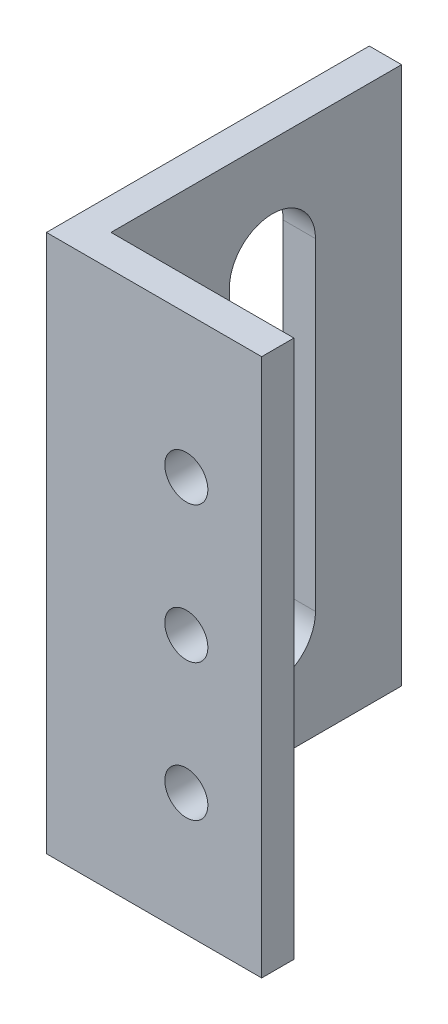
ISO-10303-21;
HEADER;
FILE_DESCRIPTION(('STEP AP214'),'2;1');
FILE_NAME('part.step','',(''),(''),'','','');
FILE_SCHEMA(('AUTOMOTIVE_DESIGN { 1 0 10303 214 1 1 1 1 }'));
ENDSEC;
DATA;
#1=APPLICATION_CONTEXT('core data for automotive mechanical design processes');
#2=APPLICATION_PROTOCOL_DEFINITION('international standard','automotive_design',2000,#1);
#3=PRODUCT_CONTEXT('',#1,'mechanical');
#4=PRODUCT('Part','Part','',(#3));
#5=PRODUCT_RELATED_PRODUCT_CATEGORY('part','',(#4));
#6=PRODUCT_DEFINITION_FORMATION('','',#4);
#7=PRODUCT_DEFINITION_CONTEXT('part definition',#1,'design');
#8=PRODUCT_DEFINITION('design','',#6,#7);
#9=PRODUCT_DEFINITION_SHAPE('','',#8);
#10=(LENGTH_UNIT() NAMED_UNIT(*) SI_UNIT(.MILLI.,.METRE.));
#11=(NAMED_UNIT(*) PLANE_ANGLE_UNIT() SI_UNIT($,.RADIAN.));
#12=(NAMED_UNIT(*) SI_UNIT($,.STERADIAN.) SOLID_ANGLE_UNIT());
#13=UNCERTAINTY_MEASURE_WITH_UNIT(LENGTH_MEASURE(1.E-05),#10,'distance_accuracy_value','');
#14=(GEOMETRIC_REPRESENTATION_CONTEXT(3) GLOBAL_UNCERTAINTY_ASSIGNED_CONTEXT((#13)) GLOBAL_UNIT_ASSIGNED_CONTEXT((#10,
#11,#12)) REPRESENTATION_CONTEXT('',''));
#15=CARTESIAN_POINT('',(0.,0.,0.));
#16=DIRECTION('',(0.,0.,1.));
#17=DIRECTION('',(1.,0.,0.));
#18=AXIS2_PLACEMENT_3D('',#15,#16,#17);
#19=CARTESIAN_POINT('',(-1.5,50.,0.));
#20=DIRECTION('',(1.,0.,0.));
#21=DIRECTION('',(0.,0.,-1.));
#22=AXIS2_PLACEMENT_3D('',#19,#20,#21);
#23=PLANE('',#22);
#24=DIRECTION('',(0.,-1.,0.));
#25=VECTOR('',#24,1.);
#26=CARTESIAN_POINT('',(-1.5,40.,-7.));
#27=LINE('',#26,#25);
#28=CARTESIAN_POINT('',(-1.5,40.,-7.));
#29=VERTEX_POINT('',#28);
#30=CARTESIAN_POINT('',(-1.5,10.,-7.));
#31=VERTEX_POINT('',#30);
#32=EDGE_CURVE('E128',#29,#31,#27,.T.);
#33=ORIENTED_EDGE('',*,*,#32,.F.);
#34=CARTESIAN_POINT('',(-1.5,40.,-3.));
#35=DIRECTION('',(-1.,0.,0.));
#36=DIRECTION('',(0.,0.,1.));
#37=AXIS2_PLACEMENT_3D('',#34,#35,#36);
#38=CIRCLE('',#37,4.);
#39=CARTESIAN_POINT('',(-1.5,40.,1.));
#40=VERTEX_POINT('',#39);
#41=EDGE_CURVE('E55',#40,#29,#38,.T.);
#42=ORIENTED_EDGE('',*,*,#41,.F.);
#43=DIRECTION('',(0.,1.,0.));
#44=VECTOR('',#43,1.);
#45=CARTESIAN_POINT('',(-1.5,40.,1.));
#46=LINE('',#45,#44);
#47=CARTESIAN_POINT('',(-1.5,10.,1.));
#48=VERTEX_POINT('',#47);
#49=EDGE_CURVE('E134',#48,#40,#46,.T.);
#50=ORIENTED_EDGE('',*,*,#49,.F.);
#51=CARTESIAN_POINT('',(-1.5,10.,-3.));
#52=DIRECTION('',(-1.,0.,0.));
#53=DIRECTION('',(0.,0.,1.));
#54=AXIS2_PLACEMENT_3D('',#51,#52,#53);
#55=CIRCLE('',#54,4.);
#56=EDGE_CURVE('E119',#31,#48,#55,.T.);
#57=ORIENTED_EDGE('',*,*,#56,.F.);
#58=EDGE_LOOP('',(#33,#42,#50,#57));
#59=FACE_BOUND('',#58,.T.);
#60=DIRECTION('',(0.,0.,1.));
#61=VECTOR('',#60,1.);
#62=CARTESIAN_POINT('',(-1.5,0.,0.));
#63=LINE('',#62,#61);
#64=CARTESIAN_POINT('',(-1.5,0.,-15.));
#65=VERTEX_POINT('',#64);
#66=CARTESIAN_POINT('',(-1.5,0.,15.));
#67=VERTEX_POINT('',#66);
#68=EDGE_CURVE('E171',#65,#67,#63,.T.);
#69=ORIENTED_EDGE('',*,*,#68,.T.);
#70=DIRECTION('',(0.,-1.,0.));
#71=VECTOR('',#70,1.);
#72=CARTESIAN_POINT('',(-1.5,50.,15.));
#73=LINE('',#72,#71);
#74=CARTESIAN_POINT('',(-1.5,50.,15.));
#75=VERTEX_POINT('',#74);
#76=EDGE_CURVE('E198',#75,#67,#73,.T.);
#77=ORIENTED_EDGE('',*,*,#76,.F.);
#78=DIRECTION('',(0.,0.,1.));
#79=VECTOR('',#78,1.);
#80=CARTESIAN_POINT('',(-1.5,50.,0.));
#81=LINE('',#80,#79);
#82=CARTESIAN_POINT('',(-1.5,50.,-15.));
#83=VERTEX_POINT('',#82);
#84=EDGE_CURVE('E153',#83,#75,#81,.T.);
#85=ORIENTED_EDGE('',*,*,#84,.F.);
#86=DIRECTION('',(0.,-1.,0.));
#87=VECTOR('',#86,1.);
#88=CARTESIAN_POINT('',(-1.5,50.,-15.));
#89=LINE('',#88,#87);
#90=EDGE_CURVE('E170',#83,#65,#89,.T.);
#91=ORIENTED_EDGE('',*,*,#90,.T.);
#92=EDGE_LOOP('',(#69,#77,#85,#91));
#93=FACE_BOUND('',#92,.T.);
#94=ADVANCED_FACE('F41',(#59,#93),#23,.F.);
#95=CARTESIAN_POINT('',(0.,50.,15.));
#96=DIRECTION('',(0.,0.,-1.));
#97=DIRECTION('',(-1.,0.,0.));
#98=AXIS2_PLACEMENT_3D('',#95,#96,#97);
#99=PLANE('',#98);
#100=CARTESIAN_POINT('',(11.5,36.8,15.));
#101=DIRECTION('',(0.,0.,1.));
#102=DIRECTION('',(1.,0.,0.));
#103=AXIS2_PLACEMENT_3D('',#100,#101,#102);
#104=CIRCLE('',#103,2.);
#105=CARTESIAN_POINT('',(13.5,36.8,15.));
#106=VERTEX_POINT('',#105);
#107=EDGE_CURVE('E144',#106,#106,#104,.T.);
#108=ORIENTED_EDGE('',*,*,#107,.F.);
#109=EDGE_LOOP('',(#108));
#110=FACE_BOUND('',#109,.T.);
#111=CARTESIAN_POINT('',(11.5000000000001,24.1,15.));
#112=DIRECTION('',(0.,0.,1.));
#113=DIRECTION('',(1.,0.,0.));
#114=AXIS2_PLACEMENT_3D('',#111,#112,#113);
#115=CIRCLE('',#114,2.);
#116=CARTESIAN_POINT('',(13.5000000000001,24.1,15.));
#117=VERTEX_POINT('',#116);
#118=EDGE_CURVE('E148',#117,#117,#115,.T.);
#119=ORIENTED_EDGE('',*,*,#118,.F.);
#120=EDGE_LOOP('',(#119));
#121=FACE_BOUND('',#120,.T.);
#122=CARTESIAN_POINT('',(11.5000000000003,11.4,15.));
#123=DIRECTION('',(0.,0.,1.));
#124=DIRECTION('',(1.,0.,0.));
#125=AXIS2_PLACEMENT_3D('',#122,#123,#124);
#126=CIRCLE('',#125,2.);
#127=CARTESIAN_POINT('',(13.5000000000003,11.4,15.));
#128=VERTEX_POINT('',#127);
#129=EDGE_CURVE('E141',#128,#128,#126,.T.);
#130=ORIENTED_EDGE('',*,*,#129,.F.);
#131=EDGE_LOOP('',(#130));
#132=FACE_BOUND('',#131,.T.);
#133=DIRECTION('',(1.,0.,0.));
#134=VECTOR('',#133,1.);
#135=CARTESIAN_POINT('',(0.,0.,15.));
#136=LINE('',#135,#134);
#137=CARTESIAN_POINT('',(18.5,0.,15.));
#138=VERTEX_POINT('',#137);
#139=EDGE_CURVE('E174',#67,#138,#136,.T.);
#140=ORIENTED_EDGE('',*,*,#139,.T.);
#141=DIRECTION('',(0.,-1.,0.));
#142=VECTOR('',#141,1.);
#143=CARTESIAN_POINT('',(18.5,50.,15.));
#144=LINE('',#143,#142);
#145=CARTESIAN_POINT('',(18.5,50.,15.));
#146=VERTEX_POINT('',#145);
#147=EDGE_CURVE('E195',#146,#138,#144,.T.);
#148=ORIENTED_EDGE('',*,*,#147,.F.);
#149=DIRECTION('',(1.,0.,0.));
#150=VECTOR('',#149,1.);
#151=CARTESIAN_POINT('',(0.,50.,15.));
#152=LINE('',#151,#150);
#153=EDGE_CURVE('E156',#75,#146,#152,.T.);
#154=ORIENTED_EDGE('',*,*,#153,.F.);
#155=ORIENTED_EDGE('',*,*,#76,.T.);
#156=EDGE_LOOP('',(#140,#148,#154,#155));
#157=FACE_BOUND('',#156,.T.);
#158=ADVANCED_FACE('F233',(#110,#121,#132,#157),#99,.F.);
#159=CARTESIAN_POINT('',(18.5,50.,0.));
#160=DIRECTION('',(-1.,0.,0.));
#161=DIRECTION('',(0.,0.,1.));
#162=AXIS2_PLACEMENT_3D('',#159,#160,#161);
#163=PLANE('',#162);
#164=DIRECTION('',(0.,0.,-1.));
#165=VECTOR('',#164,1.);
#166=CARTESIAN_POINT('',(18.5,0.,0.));
#167=LINE('',#166,#165);
#168=CARTESIAN_POINT('',(18.5,0.,12.));
#169=VERTEX_POINT('',#168);
#170=EDGE_CURVE('E177',#138,#169,#167,.T.);
#171=ORIENTED_EDGE('',*,*,#170,.T.);
#172=DIRECTION('',(0.,-1.,0.));
#173=VECTOR('',#172,1.);
#174=CARTESIAN_POINT('',(18.5,50.,12.));
#175=LINE('',#174,#173);
#176=CARTESIAN_POINT('',(18.5,50.,12.));
#177=VERTEX_POINT('',#176);
#178=EDGE_CURVE('E193',#177,#169,#175,.T.);
#179=ORIENTED_EDGE('',*,*,#178,.F.);
#180=DIRECTION('',(0.,0.,-1.));
#181=VECTOR('',#180,1.);
#182=CARTESIAN_POINT('',(18.5,50.,0.));
#183=LINE('',#182,#181);
#184=EDGE_CURVE('E159',#146,#177,#183,.T.);
#185=ORIENTED_EDGE('',*,*,#184,.F.);
#186=ORIENTED_EDGE('',*,*,#147,.T.);
#187=EDGE_LOOP('',(#171,#179,#185,#186));
#188=FACE_BOUND('',#187,.T.);
#189=ADVANCED_FACE('F237',(#188),#163,.F.);
#190=CARTESIAN_POINT('',(0.,50.,12.));
#191=DIRECTION('',(0.,0.,-1.));
#192=DIRECTION('',(-1.,0.,0.));
#193=AXIS2_PLACEMENT_3D('',#190,#191,#192);
#194=PLANE('',#193);
#195=CARTESIAN_POINT('',(11.5,36.8,12.));
#196=DIRECTION('',(0.,0.,-1.));
#197=DIRECTION('',(-1.,0.,0.));
#198=AXIS2_PLACEMENT_3D('',#195,#196,#197);
#199=CIRCLE('',#198,2.);
#200=CARTESIAN_POINT('',(9.50000000000001,36.8,12.));
#201=VERTEX_POINT('',#200);
#202=EDGE_CURVE('E175',#201,#201,#199,.T.);
#203=ORIENTED_EDGE('',*,*,#202,.F.);
#204=EDGE_LOOP('',(#203));
#205=FACE_BOUND('',#204,.T.);
#206=CARTESIAN_POINT('',(11.5000000000001,24.1,12.));
#207=DIRECTION('',(0.,0.,-1.));
#208=DIRECTION('',(-1.,0.,0.));
#209=AXIS2_PLACEMENT_3D('',#206,#207,#208);
#210=CIRCLE('',#209,2.);
#211=CARTESIAN_POINT('',(9.50000000000014,24.1,12.));
#212=VERTEX_POINT('',#211);
#213=EDGE_CURVE('E204',#212,#212,#210,.T.);
#214=ORIENTED_EDGE('',*,*,#213,.F.);
#215=EDGE_LOOP('',(#214));
#216=FACE_BOUND('',#215,.T.);
#217=CARTESIAN_POINT('',(11.5000000000003,11.4,12.));
#218=DIRECTION('',(0.,0.,-1.));
#219=DIRECTION('',(-1.,0.,0.));
#220=AXIS2_PLACEMENT_3D('',#217,#218,#219);
#221=CIRCLE('',#220,2.);
#222=CARTESIAN_POINT('',(9.50000000000027,11.4,12.));
#223=VERTEX_POINT('',#222);
#224=EDGE_CURVE('E147',#223,#223,#221,.T.);
#225=ORIENTED_EDGE('',*,*,#224,.F.);
#226=EDGE_LOOP('',(#225));
#227=FACE_BOUND('',#226,.T.);
#228=DIRECTION('',(1.,0.,0.));
#229=VECTOR('',#228,1.);
#230=CARTESIAN_POINT('',(0.,0.,12.));
#231=LINE('',#230,#229);
#232=CARTESIAN_POINT('',(1.5,0.,12.));
#233=VERTEX_POINT('',#232);
#234=EDGE_CURVE('E180',#233,#169,#231,.T.);
#235=ORIENTED_EDGE('',*,*,#234,.F.);
#236=DIRECTION('',(0.,-1.,0.));
#237=VECTOR('',#236,1.);
#238=CARTESIAN_POINT('',(1.5,50.,12.));
#239=LINE('',#238,#237);
#240=CARTESIAN_POINT('',(1.5,50.,12.));
#241=VERTEX_POINT('',#240);
#242=EDGE_CURVE('E191',#241,#233,#239,.T.);
#243=ORIENTED_EDGE('',*,*,#242,.F.);
#244=DIRECTION('',(1.,0.,0.));
#245=VECTOR('',#244,1.);
#246=CARTESIAN_POINT('',(0.,50.,12.));
#247=LINE('',#246,#245);
#248=EDGE_CURVE('E161',#241,#177,#247,.T.);
#249=ORIENTED_EDGE('',*,*,#248,.T.);
#250=ORIENTED_EDGE('',*,*,#178,.T.);
#251=EDGE_LOOP('',(#235,#243,#249,#250));
#252=FACE_BOUND('',#251,.T.);
#253=ADVANCED_FACE('F244',(#205,#216,#227,#252),#194,.T.);
#254=CARTESIAN_POINT('',(1.5,50.,0.));
#255=DIRECTION('',(1.,0.,0.));
#256=DIRECTION('',(0.,0.,-1.));
#257=AXIS2_PLACEMENT_3D('',#254,#255,#256);
#258=PLANE('',#257);
#259=CARTESIAN_POINT('',(1.5,40.,-3.));
#260=DIRECTION('',(1.,0.,0.));
#261=DIRECTION('',(0.,0.,-1.));
#262=AXIS2_PLACEMENT_3D('',#259,#260,#261);
#263=CIRCLE('',#262,4.);
#264=CARTESIAN_POINT('',(1.5,40.,-7.));
#265=VERTEX_POINT('',#264);
#266=CARTESIAN_POINT('',(1.5,40.,1.));
#267=VERTEX_POINT('',#266);
#268=EDGE_CURVE('E11',#265,#267,#263,.T.);
#269=ORIENTED_EDGE('',*,*,#268,.F.);
#270=DIRECTION('',(0.,1.,0.));
#271=VECTOR('',#270,1.);
#272=CARTESIAN_POINT('',(1.5,50.,-7.));
#273=LINE('',#272,#271);
#274=CARTESIAN_POINT('',(1.5,10.,-7.));
#275=VERTEX_POINT('',#274);
#276=EDGE_CURVE('E201',#275,#265,#273,.T.);
#277=ORIENTED_EDGE('',*,*,#276,.F.);
#278=CARTESIAN_POINT('',(1.5,10.,-3.));
#279=DIRECTION('',(1.,0.,0.));
#280=DIRECTION('',(0.,0.,-1.));
#281=AXIS2_PLACEMENT_3D('',#278,#279,#280);
#282=CIRCLE('',#281,4.);
#283=CARTESIAN_POINT('',(1.5,10.,1.));
#284=VERTEX_POINT('',#283);
#285=EDGE_CURVE('E122',#284,#275,#282,.T.);
#286=ORIENTED_EDGE('',*,*,#285,.F.);
#287=DIRECTION('',(0.,-1.,0.));
#288=VECTOR('',#287,1.);
#289=CARTESIAN_POINT('',(1.5,50.,1.));
#290=LINE('',#289,#288);
#291=EDGE_CURVE('E48',#267,#284,#290,.T.);
#292=ORIENTED_EDGE('',*,*,#291,.F.);
#293=EDGE_LOOP('',(#269,#277,#286,#292));
#294=FACE_BOUND('',#293,.T.);
#295=DIRECTION('',(0.,0.,1.));
#296=VECTOR('',#295,1.);
#297=CARTESIAN_POINT('',(1.5,0.,0.));
#298=LINE('',#297,#296);
#299=CARTESIAN_POINT('',(1.5,0.,-15.));
#300=VERTEX_POINT('',#299);
#301=EDGE_CURVE('E183',#300,#233,#298,.T.);
#302=ORIENTED_EDGE('',*,*,#301,.F.);
#303=DIRECTION('',(0.,-1.,0.));
#304=VECTOR('',#303,1.);
#305=CARTESIAN_POINT('',(1.5,50.,-15.));
#306=LINE('',#305,#304);
#307=CARTESIAN_POINT('',(1.5,50.,-15.));
#308=VERTEX_POINT('',#307);
#309=EDGE_CURVE('E189',#308,#300,#306,.T.);
#310=ORIENTED_EDGE('',*,*,#309,.F.);
#311=DIRECTION('',(0.,0.,1.));
#312=VECTOR('',#311,1.);
#313=CARTESIAN_POINT('',(1.5,50.,0.));
#314=LINE('',#313,#312);
#315=EDGE_CURVE('E164',#308,#241,#314,.T.);
#316=ORIENTED_EDGE('',*,*,#315,.T.);
#317=ORIENTED_EDGE('',*,*,#242,.T.);
#318=EDGE_LOOP('',(#302,#310,#316,#317));
#319=FACE_BOUND('',#318,.T.);
#320=ADVANCED_FACE('F216',(#294,#319),#258,.T.);
#321=CARTESIAN_POINT('',(0.,50.,-15.));
#322=DIRECTION('',(0.,0.,-1.));
#323=DIRECTION('',(-1.,0.,0.));
#324=AXIS2_PLACEMENT_3D('',#321,#322,#323);
#325=PLANE('',#324);
#326=DIRECTION('',(1.,0.,0.));
#327=VECTOR('',#326,1.);
#328=CARTESIAN_POINT('',(0.,0.,-15.));
#329=LINE('',#328,#327);
#330=EDGE_CURVE('E157',#65,#300,#329,.T.);
#331=ORIENTED_EDGE('',*,*,#330,.F.);
#332=ORIENTED_EDGE('',*,*,#90,.F.);
#333=DIRECTION('',(1.,0.,0.));
#334=VECTOR('',#333,1.);
#335=CARTESIAN_POINT('',(0.,50.,-15.));
#336=LINE('',#335,#334);
#337=EDGE_CURVE('E167',#83,#308,#336,.T.);
#338=ORIENTED_EDGE('',*,*,#337,.T.);
#339=ORIENTED_EDGE('',*,*,#309,.T.);
#340=EDGE_LOOP('',(#331,#332,#338,#339));
#341=FACE_BOUND('',#340,.T.);
#342=ADVANCED_FACE('F253',(#341),#325,.T.);
#343=CARTESIAN_POINT('',(0.,50.,0.));
#344=DIRECTION('',(0.,1.,0.));
#345=DIRECTION('',(0.,0.,1.));
#346=AXIS2_PLACEMENT_3D('',#343,#344,#345);
#347=PLANE('',#346);
#348=ORIENTED_EDGE('',*,*,#84,.T.);
#349=ORIENTED_EDGE('',*,*,#153,.T.);
#350=ORIENTED_EDGE('',*,*,#184,.T.);
#351=ORIENTED_EDGE('',*,*,#248,.F.);
#352=ORIENTED_EDGE('',*,*,#315,.F.);
#353=ORIENTED_EDGE('',*,*,#337,.F.);
#354=EDGE_LOOP('',(#348,#349,#350,#351,#352,#353));
#355=FACE_BOUND('',#354,.T.);
#356=ADVANCED_FACE('F256',(#355),#347,.T.);
#357=CARTESIAN_POINT('',(0.,0.,0.));
#358=DIRECTION('',(0.,1.,0.));
#359=DIRECTION('',(0.,0.,1.));
#360=AXIS2_PLACEMENT_3D('',#357,#358,#359);
#361=PLANE('',#360);
#362=ORIENTED_EDGE('',*,*,#68,.F.);
#363=ORIENTED_EDGE('',*,*,#330,.T.);
#364=ORIENTED_EDGE('',*,*,#301,.T.);
#365=ORIENTED_EDGE('',*,*,#234,.T.);
#366=ORIENTED_EDGE('',*,*,#170,.F.);
#367=ORIENTED_EDGE('',*,*,#139,.F.);
#368=EDGE_LOOP('',(#362,#363,#364,#365,#366,#367));
#369=FACE_BOUND('',#368,.T.);
#370=ADVANCED_FACE('F258',(#369),#361,.F.);
#371=CARTESIAN_POINT('',(11.5000000000003,11.4,5.));
#372=DIRECTION('',(0.,0.,1.));
#373=DIRECTION('',(1.,0.,0.));
#374=AXIS2_PLACEMENT_3D('',#371,#372,#373);
#375=CYLINDRICAL_SURFACE('',#374,2.);
#376=ORIENTED_EDGE('',*,*,#224,.T.);
#377=EDGE_LOOP('',(#376));
#378=FACE_BOUND('',#377,.T.);
#379=ORIENTED_EDGE('',*,*,#129,.T.);
#380=EDGE_LOOP('',(#379));
#381=FACE_BOUND('',#380,.T.);
#382=ADVANCED_FACE('F260',(#378,#381),#375,.F.);
#383=CARTESIAN_POINT('',(11.5000000000001,24.1,5.));
#384=DIRECTION('',(0.,0.,1.));
#385=DIRECTION('',(1.,0.,0.));
#386=AXIS2_PLACEMENT_3D('',#383,#384,#385);
#387=CYLINDRICAL_SURFACE('',#386,2.);
#388=ORIENTED_EDGE('',*,*,#213,.T.);
#389=EDGE_LOOP('',(#388));
#390=FACE_BOUND('',#389,.T.);
#391=ORIENTED_EDGE('',*,*,#118,.T.);
#392=EDGE_LOOP('',(#391));
#393=FACE_BOUND('',#392,.T.);
#394=ADVANCED_FACE('F228',(#390,#393),#387,.F.);
#395=CARTESIAN_POINT('',(11.5,36.8,5.));
#396=DIRECTION('',(0.,0.,1.));
#397=DIRECTION('',(1.,0.,0.));
#398=AXIS2_PLACEMENT_3D('',#395,#396,#397);
#399=CYLINDRICAL_SURFACE('',#398,2.);
#400=ORIENTED_EDGE('',*,*,#202,.T.);
#401=EDGE_LOOP('',(#400));
#402=FACE_BOUND('',#401,.T.);
#403=ORIENTED_EDGE('',*,*,#107,.T.);
#404=EDGE_LOOP('',(#403));
#405=FACE_BOUND('',#404,.T.);
#406=ADVANCED_FACE('F220',(#402,#405),#399,.F.);
#407=CARTESIAN_POINT('',(8.5,40.,-3.));
#408=DIRECTION('',(-1.,0.,0.));
#409=DIRECTION('',(0.,0.,1.));
#410=AXIS2_PLACEMENT_3D('',#407,#408,#409);
#411=CYLINDRICAL_SURFACE('',#410,4.);
#412=ORIENTED_EDGE('',*,*,#268,.T.);
#413=DIRECTION('',(-1.,0.,0.));
#414=VECTOR('',#413,1.);
#415=CARTESIAN_POINT('',(8.5,40.,1.));
#416=LINE('',#415,#414);
#417=EDGE_CURVE('E139',#267,#40,#416,.T.);
#418=ORIENTED_EDGE('',*,*,#417,.T.);
#419=ORIENTED_EDGE('',*,*,#41,.T.);
#420=DIRECTION('',(-1.,0.,0.));
#421=VECTOR('',#420,1.);
#422=CARTESIAN_POINT('',(8.5,40.,-7.));
#423=LINE('',#422,#421);
#424=EDGE_CURVE('E125',#265,#29,#423,.T.);
#425=ORIENTED_EDGE('',*,*,#424,.F.);
#426=EDGE_LOOP('',(#412,#418,#419,#425));
#427=FACE_BOUND('',#426,.T.);
#428=ADVANCED_FACE('F218',(#427),#411,.F.);
#429=CARTESIAN_POINT('',(8.5,40.,1.));
#430=DIRECTION('',(0.,0.,1.));
#431=DIRECTION('',(1.,0.,0.));
#432=AXIS2_PLACEMENT_3D('',#429,#430,#431);
#433=PLANE('',#432);
#434=ORIENTED_EDGE('',*,*,#291,.T.);
#435=DIRECTION('',(-1.,0.,0.));
#436=VECTOR('',#435,1.);
#437=CARTESIAN_POINT('',(8.5,10.,1.));
#438=LINE('',#437,#436);
#439=EDGE_CURVE('E124',#284,#48,#438,.T.);
#440=ORIENTED_EDGE('',*,*,#439,.T.);
#441=ORIENTED_EDGE('',*,*,#49,.T.);
#442=ORIENTED_EDGE('',*,*,#417,.F.);
#443=EDGE_LOOP('',(#434,#440,#441,#442));
#444=FACE_BOUND('',#443,.T.);
#445=ADVANCED_FACE('F213',(#444),#433,.F.);
#446=CARTESIAN_POINT('',(8.5,10.,-3.));
#447=DIRECTION('',(-1.,0.,0.));
#448=DIRECTION('',(0.,0.,1.));
#449=AXIS2_PLACEMENT_3D('',#446,#447,#448);
#450=CYLINDRICAL_SURFACE('',#449,4.);
#451=ORIENTED_EDGE('',*,*,#285,.T.);
#452=DIRECTION('',(-1.,0.,0.));
#453=VECTOR('',#452,1.);
#454=CARTESIAN_POINT('',(8.5,10.,-7.));
#455=LINE('',#454,#453);
#456=EDGE_CURVE('E63',#275,#31,#455,.T.);
#457=ORIENTED_EDGE('',*,*,#456,.T.);
#458=ORIENTED_EDGE('',*,*,#56,.T.);
#459=ORIENTED_EDGE('',*,*,#439,.F.);
#460=EDGE_LOOP('',(#451,#457,#458,#459));
#461=FACE_BOUND('',#460,.T.);
#462=ADVANCED_FACE('F116',(#461),#450,.F.);
#463=CARTESIAN_POINT('',(8.5,40.,-7.));
#464=DIRECTION('',(0.,0.,-1.));
#465=DIRECTION('',(-1.,0.,0.));
#466=AXIS2_PLACEMENT_3D('',#463,#464,#465);
#467=PLANE('',#466);
#468=ORIENTED_EDGE('',*,*,#276,.T.);
#469=ORIENTED_EDGE('',*,*,#424,.T.);
#470=ORIENTED_EDGE('',*,*,#32,.T.);
#471=ORIENTED_EDGE('',*,*,#456,.F.);
#472=EDGE_LOOP('',(#468,#469,#470,#471));
#473=FACE_BOUND('',#472,.T.);
#474=ADVANCED_FACE('F129',(#473),#467,.F.);
#475=CLOSED_SHELL('',(#94,#158,#189,#253,#320,#342,#356,#370,#382,#394,#406,#428,#445,#462,#474));
#476=MANIFOLD_SOLID_BREP('B2',#475);
#477=ADVANCED_BREP_SHAPE_REPRESENTATION('',(#18,#476),#14);
#478=SHAPE_DEFINITION_REPRESENTATION(#9,#477);
ENDSEC;
END-ISO-10303-21;
